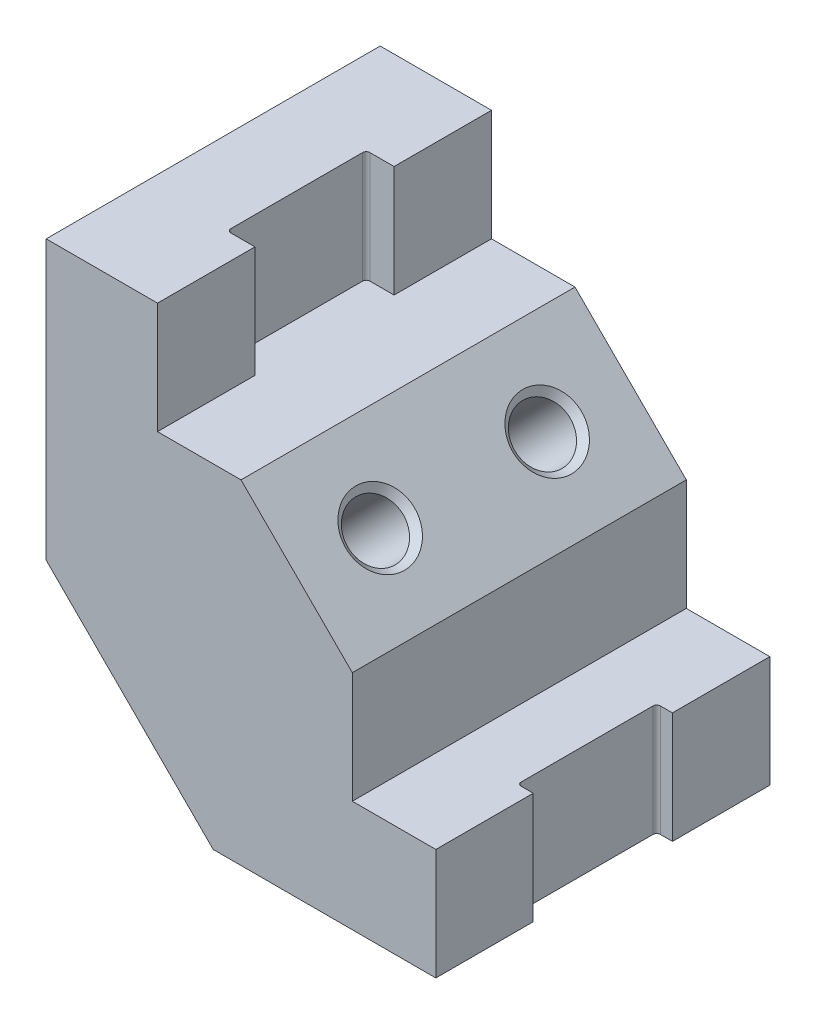
ISO-10303-21;
HEADER;
FILE_DESCRIPTION(('STEP AP214'),'2;1');
FILE_NAME('part.step','',(''),(''),'','','');
FILE_SCHEMA(('AUTOMOTIVE_DESIGN { 1 0 10303 214 1 1 1 1 }'));
ENDSEC;
DATA;
#1=APPLICATION_CONTEXT('core data for automotive mechanical design processes');
#2=APPLICATION_PROTOCOL_DEFINITION('international standard','automotive_design',2000,#1);
#3=PRODUCT_CONTEXT('',#1,'mechanical');
#4=PRODUCT('Part','Part','',(#3));
#5=PRODUCT_RELATED_PRODUCT_CATEGORY('part','',(#4));
#6=PRODUCT_DEFINITION_FORMATION('','',#4);
#7=PRODUCT_DEFINITION_CONTEXT('part definition',#1,'design');
#8=PRODUCT_DEFINITION('design','',#6,#7);
#9=PRODUCT_DEFINITION_SHAPE('','',#8);
#10=(LENGTH_UNIT() NAMED_UNIT(*) SI_UNIT(.MILLI.,.METRE.));
#11=(NAMED_UNIT(*) PLANE_ANGLE_UNIT() SI_UNIT($,.RADIAN.));
#12=(NAMED_UNIT(*) SI_UNIT($,.STERADIAN.) SOLID_ANGLE_UNIT());
#13=UNCERTAINTY_MEASURE_WITH_UNIT(LENGTH_MEASURE(1.E-05),#10,'distance_accuracy_value','');
#14=(GEOMETRIC_REPRESENTATION_CONTEXT(3) GLOBAL_UNCERTAINTY_ASSIGNED_CONTEXT((#13)) GLOBAL_UNIT_ASSIGNED_CONTEXT((#10,
#11,#12)) REPRESENTATION_CONTEXT('',''));
#15=CARTESIAN_POINT('',(0.,0.,0.));
#16=DIRECTION('',(0.,0.,1.));
#17=DIRECTION('',(1.,0.,0.));
#18=AXIS2_PLACEMENT_3D('',#15,#16,#17);
#19=CARTESIAN_POINT('',(88.9,-101.6,38.1));
#20=DIRECTION('',(-1.,0.,0.));
#21=DIRECTION('',(0.,0.,1.));
#22=AXIS2_PLACEMENT_3D('',#19,#20,#21);
#23=PLANE('',#22);
#24=DIRECTION('',(0.,0.,-1.));
#25=VECTOR('',#24,1.);
#26=CARTESIAN_POINT('',(88.9,-101.6,38.1));
#27=LINE('',#26,#25);
#28=CARTESIAN_POINT('',(88.9,-101.6,38.1));
#29=VERTEX_POINT('',#28);
#30=CARTESIAN_POINT('',(88.9,-101.6,15.875));
#31=VERTEX_POINT('',#30);
#32=EDGE_CURVE('E225',#29,#31,#27,.T.);
#33=ORIENTED_EDGE('',*,*,#32,.T.);
#34=DIRECTION('',(0.,1.,0.));
#35=VECTOR('',#34,1.);
#36=CARTESIAN_POINT('',(88.9,-101.6,15.875));
#37=LINE('',#36,#35);
#38=CARTESIAN_POINT('',(88.9,-76.2,15.875));
#39=VERTEX_POINT('',#38);
#40=EDGE_CURVE('E216',#31,#39,#37,.T.);
#41=ORIENTED_EDGE('',*,*,#40,.T.);
#42=DIRECTION('',(0.,0.,-1.));
#43=VECTOR('',#42,1.);
#44=CARTESIAN_POINT('',(88.9,-76.2,38.1));
#45=LINE('',#44,#43);
#46=CARTESIAN_POINT('',(88.9,-76.2,38.1));
#47=VERTEX_POINT('',#46);
#48=EDGE_CURVE('E226',#47,#39,#45,.T.);
#49=ORIENTED_EDGE('',*,*,#48,.F.);
#50=DIRECTION('',(0.,1.,0.));
#51=VECTOR('',#50,1.);
#52=CARTESIAN_POINT('',(88.9,-101.6,38.1));
#53=LINE('',#52,#51);
#54=EDGE_CURVE('E381',#29,#47,#53,.T.);
#55=ORIENTED_EDGE('',*,*,#54,.F.);
#56=EDGE_LOOP('',(#33,#41,#49,#55));
#57=FACE_BOUND('',#56,.T.);
#58=ADVANCED_FACE('F45',(#57),#23,.F.);
#59=CARTESIAN_POINT('',(25.4,-25.4,38.1));
#60=DIRECTION('',(-1.,0.,0.));
#61=DIRECTION('',(0.,0.,1.));
#62=AXIS2_PLACEMENT_3D('',#59,#60,#61);
#63=PLANE('',#62);
#64=DIRECTION('',(0.,0.,-1.));
#65=VECTOR('',#64,1.);
#66=CARTESIAN_POINT('',(25.4,0.,38.1));
#67=LINE('',#66,#65);
#68=CARTESIAN_POINT('',(25.4,0.,-15.875));
#69=VERTEX_POINT('',#68);
#70=CARTESIAN_POINT('',(25.4,0.,-38.1));
#71=VERTEX_POINT('',#70);
#72=EDGE_CURVE('E399',#69,#71,#67,.T.);
#73=ORIENTED_EDGE('',*,*,#72,.F.);
#74=DIRECTION('',(0.,1.,0.));
#75=VECTOR('',#74,1.);
#76=CARTESIAN_POINT('',(25.4,-57.7787739113142,-15.875));
#77=LINE('',#76,#75);
#78=CARTESIAN_POINT('',(25.4,-25.4,-15.875));
#79=VERTEX_POINT('',#78);
#80=EDGE_CURVE('E357',#79,#69,#77,.T.);
#81=ORIENTED_EDGE('',*,*,#80,.F.);
#82=DIRECTION('',(0.,0.,-1.));
#83=VECTOR('',#82,1.);
#84=CARTESIAN_POINT('',(25.4,-25.4,38.1));
#85=LINE('',#84,#83);
#86=CARTESIAN_POINT('',(25.4,-25.4,-38.1));
#87=VERTEX_POINT('',#86);
#88=EDGE_CURVE('E433',#79,#87,#85,.T.);
#89=ORIENTED_EDGE('',*,*,#88,.T.);
#90=DIRECTION('',(0.,1.,0.));
#91=VECTOR('',#90,1.);
#92=CARTESIAN_POINT('',(25.4,-25.4,-38.1));
#93=LINE('',#92,#91);
#94=EDGE_CURVE('E372',#87,#71,#93,.T.);
#95=ORIENTED_EDGE('',*,*,#94,.T.);
#96=EDGE_LOOP('',(#73,#81,#89,#95));
#97=FACE_BOUND('',#96,.T.);
#98=ADVANCED_FACE('F498',(#97),#63,.F.);
#99=CARTESIAN_POINT('',(25.4,0.,38.1));
#100=DIRECTION('',(0.,-1.,0.));
#101=DIRECTION('',(1.,0.,0.));
#102=AXIS2_PLACEMENT_3D('',#99,#100,#101);
#103=PLANE('',#102);
#104=DIRECTION('',(0.,0.,1.));
#105=VECTOR('',#104,1.);
#106=CARTESIAN_POINT('',(19.05,0.,-15.875));
#107=LINE('',#106,#105);
#108=CARTESIAN_POINT('',(19.05,0.,-15.0368));
#109=VERTEX_POINT('',#108);
#110=CARTESIAN_POINT('',(19.05,0.,15.0368));
#111=VERTEX_POINT('',#110);
#112=EDGE_CURVE('E325',#109,#111,#107,.T.);
#113=ORIENTED_EDGE('',*,*,#112,.F.);
#114=CARTESIAN_POINT('',(19.8882,0.,-15.0368));
#115=DIRECTION('',(0.,-1.,0.));
#116=DIRECTION('',(1.,0.,0.));
#117=AXIS2_PLACEMENT_3D('',#114,#115,#116);
#118=CIRCLE('',#117,0.8382);
#119=CARTESIAN_POINT('',(19.8882,0.,-15.875));
#120=VERTEX_POINT('',#119);
#121=EDGE_CURVE('E11',#109,#120,#118,.T.);
#122=ORIENTED_EDGE('',*,*,#121,.T.);
#123=DIRECTION('',(-1.,0.,0.));
#124=VECTOR('',#123,1.);
#125=CARTESIAN_POINT('',(25.4,0.,-15.875));
#126=LINE('',#125,#124);
#127=EDGE_CURVE('E337',#69,#120,#126,.T.);
#128=ORIENTED_EDGE('',*,*,#127,.F.);
#129=ORIENTED_EDGE('',*,*,#72,.T.);
#130=DIRECTION('',(-1.,0.,0.));
#131=VECTOR('',#130,1.);
#132=CARTESIAN_POINT('',(25.4,0.,-38.1));
#133=LINE('',#132,#131);
#134=CARTESIAN_POINT('',(0.,0.,-38.1));
#135=VERTEX_POINT('',#134);
#136=EDGE_CURVE('E366',#71,#135,#133,.T.);
#137=ORIENTED_EDGE('',*,*,#136,.T.);
#138=DIRECTION('',(0.,0.,-1.));
#139=VECTOR('',#138,1.);
#140=CARTESIAN_POINT('',(0.,0.,38.1));
#141=LINE('',#140,#139);
#142=CARTESIAN_POINT('',(0.,0.,38.1));
#143=VERTEX_POINT('',#142);
#144=EDGE_CURVE('E242',#143,#135,#141,.T.);
#145=ORIENTED_EDGE('',*,*,#144,.F.);
#146=DIRECTION('',(-1.,0.,0.));
#147=VECTOR('',#146,1.);
#148=CARTESIAN_POINT('',(25.4,0.,38.1));
#149=LINE('',#148,#147);
#150=CARTESIAN_POINT('',(25.4,0.,38.1));
#151=VERTEX_POINT('',#150);
#152=EDGE_CURVE('E367',#151,#143,#149,.T.);
#153=ORIENTED_EDGE('',*,*,#152,.F.);
#154=CARTESIAN_POINT('',(25.4,0.,15.875));
#155=VERTEX_POINT('',#154);
#156=EDGE_CURVE('E430',#151,#155,#67,.T.);
#157=ORIENTED_EDGE('',*,*,#156,.T.);
#158=DIRECTION('',(1.,0.,0.));
#159=VECTOR('',#158,1.);
#160=CARTESIAN_POINT('',(25.4,0.,15.875));
#161=LINE('',#160,#159);
#162=CARTESIAN_POINT('',(19.8882,0.,15.875));
#163=VERTEX_POINT('',#162);
#164=EDGE_CURVE('E327',#163,#155,#161,.T.);
#165=ORIENTED_EDGE('',*,*,#164,.F.);
#166=CARTESIAN_POINT('',(19.8882,0.,15.0368));
#167=DIRECTION('',(0.,-1.,0.));
#168=DIRECTION('',(1.,0.,0.));
#169=AXIS2_PLACEMENT_3D('',#166,#167,#168);
#170=CIRCLE('',#169,0.8382);
#171=EDGE_CURVE('E54',#163,#111,#170,.T.);
#172=ORIENTED_EDGE('',*,*,#171,.T.);
#173=EDGE_LOOP('',(#113,#122,#128,#129,#137,#145,#153,#157,#165,#172));
#174=FACE_BOUND('',#173,.T.);
#175=ADVANCED_FACE('F324',(#174),#103,.F.);
#176=CARTESIAN_POINT('',(0.,0.,38.1));
#177=DIRECTION('',(1.,0.,0.));
#178=DIRECTION('',(0.,1.,0.));
#179=AXIS2_PLACEMENT_3D('',#176,#177,#178);
#180=PLANE('',#179);
#181=DIRECTION('',(0.,-1.,0.));
#182=VECTOR('',#181,1.);
#183=CARTESIAN_POINT('',(0.,0.,-38.1));
#184=LINE('',#183,#182);
#185=CARTESIAN_POINT('',(0.,-63.4999999999999,-38.1));
#186=VERTEX_POINT('',#185);
#187=EDGE_CURVE('E403',#135,#186,#184,.T.);
#188=ORIENTED_EDGE('',*,*,#187,.T.);
#189=DIRECTION('',(0.,0.,-1.));
#190=VECTOR('',#189,1.);
#191=CARTESIAN_POINT('',(0.,-63.4999999999999,38.1));
#192=LINE('',#191,#190);
#193=CARTESIAN_POINT('',(0.,-63.4999999999999,38.1));
#194=VERTEX_POINT('',#193);
#195=EDGE_CURVE('E238',#194,#186,#192,.T.);
#196=ORIENTED_EDGE('',*,*,#195,.F.);
#197=DIRECTION('',(0.,-1.,0.));
#198=VECTOR('',#197,1.);
#199=CARTESIAN_POINT('',(0.,0.,38.1));
#200=LINE('',#199,#198);
#201=EDGE_CURVE('E371',#143,#194,#200,.T.);
#202=ORIENTED_EDGE('',*,*,#201,.F.);
#203=ORIENTED_EDGE('',*,*,#144,.T.);
#204=EDGE_LOOP('',(#188,#196,#202,#203));
#205=FACE_BOUND('',#204,.T.);
#206=ADVANCED_FACE('F517',(#205),#180,.F.);
#207=CARTESIAN_POINT('',(0.,-63.4999999999999,38.1));
#208=DIRECTION('',(0.707106781186548,0.707106781186546,0.));
#209=DIRECTION('',(-0.707106781186547,0.707106781186549,0.));
#210=AXIS2_PLACEMENT_3D('',#207,#208,#209);
#211=PLANE('',#210);
#212=CARTESIAN_POINT('',(15.8769178448081,-79.3769178448081,-19.05));
#213=DIRECTION('',(0.707106781186548,0.707106781186546,0.));
#214=DIRECTION('',(-0.707106781186547,0.707106781186549,0.));
#215=AXIS2_PLACEMENT_3D('',#212,#213,#214);
#216=CIRCLE('',#215,7.87399999999996);
#217=CARTESIAN_POINT('',(21.444676639871,-84.9446766398709,-19.05));
#218=VERTEX_POINT('',#217);
#219=EDGE_CURVE('E250',#218,#218,#216,.T.);
#220=ORIENTED_EDGE('',*,*,#219,.T.);
#221=EDGE_LOOP('',(#220));
#222=FACE_BOUND('',#221,.T.);
#223=CARTESIAN_POINT('',(15.8769178448081,-79.3769178448081,19.05));
#224=DIRECTION('',(0.707106781186548,0.707106781186546,0.));
#225=DIRECTION('',(-0.707106781186547,0.707106781186549,0.));
#226=AXIS2_PLACEMENT_3D('',#223,#224,#225);
#227=CIRCLE('',#226,7.87399999999999);
#228=CARTESIAN_POINT('',(10.3091590497453,-73.8091590497452,19.05));
#229=VERTEX_POINT('',#228);
#230=EDGE_CURVE('E246',#229,#229,#227,.T.);
#231=ORIENTED_EDGE('',*,*,#230,.T.);
#232=EDGE_LOOP('',(#231));
#233=FACE_BOUND('',#232,.T.);
#234=DIRECTION('',(0.707106781186546,-0.707106781186548,0.));
#235=VECTOR('',#234,1.);
#236=CARTESIAN_POINT('',(0.,-63.4999999999999,-38.1));
#237=LINE('',#236,#235);
#238=CARTESIAN_POINT('',(38.1,-101.6,-38.1));
#239=VERTEX_POINT('',#238);
#240=EDGE_CURVE('E406',#186,#239,#237,.T.);
#241=ORIENTED_EDGE('',*,*,#240,.T.);
#242=DIRECTION('',(0.,0.,-1.));
#243=VECTOR('',#242,1.);
#244=CARTESIAN_POINT('',(38.1,-101.6,38.1));
#245=LINE('',#244,#243);
#246=CARTESIAN_POINT('',(38.1,-101.6,38.1));
#247=VERTEX_POINT('',#246);
#248=EDGE_CURVE('E231',#247,#239,#245,.T.);
#249=ORIENTED_EDGE('',*,*,#248,.F.);
#250=DIRECTION('',(0.707106781186546,-0.707106781186548,0.));
#251=VECTOR('',#250,1.);
#252=CARTESIAN_POINT('',(0.,-63.4999999999999,38.1));
#253=LINE('',#252,#251);
#254=EDGE_CURVE('E375',#194,#247,#253,.T.);
#255=ORIENTED_EDGE('',*,*,#254,.F.);
#256=ORIENTED_EDGE('',*,*,#195,.T.);
#257=EDGE_LOOP('',(#241,#249,#255,#256));
#258=FACE_BOUND('',#257,.T.);
#259=ADVANCED_FACE('F513',(#222,#233,#258),#211,.F.);
#260=CARTESIAN_POINT('',(38.1,-101.6,38.1));
#261=DIRECTION('',(0.,1.,0.));
#262=DIRECTION('',(0.,0.,1.));
#263=AXIS2_PLACEMENT_3D('',#260,#261,#262);
#264=PLANE('',#263);
#265=DIRECTION('',(-1.,0.,0.));
#266=VECTOR('',#265,1.);
#267=CARTESIAN_POINT('',(88.9,-101.6,-15.875));
#268=LINE('',#267,#266);
#269=CARTESIAN_POINT('',(88.9,-101.6,-15.875));
#270=VERTEX_POINT('',#269);
#271=CARTESIAN_POINT('',(86.1478547786392,-101.6,-15.875));
#272=VERTEX_POINT('',#271);
#273=EDGE_CURVE('E193',#270,#272,#268,.T.);
#274=ORIENTED_EDGE('',*,*,#273,.T.);
#275=CARTESIAN_POINT('',(86.1478547786392,-101.6,-15.0368));
#276=DIRECTION('',(0.,1.,0.));
#277=DIRECTION('',(0.,0.,1.));
#278=AXIS2_PLACEMENT_3D('',#275,#276,#277);
#279=CIRCLE('',#278,0.8382);
#280=CARTESIAN_POINT('',(85.3096547786392,-101.6,-15.0368));
#281=VERTEX_POINT('',#280);
#282=EDGE_CURVE('E319',#272,#281,#279,.T.);
#283=ORIENTED_EDGE('',*,*,#282,.T.);
#284=DIRECTION('',(0.,0.,1.));
#285=VECTOR('',#284,1.);
#286=CARTESIAN_POINT('',(85.3096547786392,-101.6,-15.875));
#287=LINE('',#286,#285);
#288=CARTESIAN_POINT('',(85.3096547786392,-101.6,15.0368));
#289=VERTEX_POINT('',#288);
#290=EDGE_CURVE('E205',#281,#289,#287,.T.);
#291=ORIENTED_EDGE('',*,*,#290,.T.);
#292=CARTESIAN_POINT('',(86.1478547786392,-101.6,15.0368));
#293=DIRECTION('',(0.,1.,0.));
#294=DIRECTION('',(0.,0.,1.));
#295=AXIS2_PLACEMENT_3D('',#292,#293,#294);
#296=CIRCLE('',#295,0.8382);
#297=CARTESIAN_POINT('',(86.1478547786392,-101.6,15.875));
#298=VERTEX_POINT('',#297);
#299=EDGE_CURVE('E313',#289,#298,#296,.T.);
#300=ORIENTED_EDGE('',*,*,#299,.T.);
#301=DIRECTION('',(1.,0.,0.));
#302=VECTOR('',#301,1.);
#303=CARTESIAN_POINT('',(88.9,-101.6,15.875));
#304=LINE('',#303,#302);
#305=EDGE_CURVE('E217',#298,#31,#304,.T.);
#306=ORIENTED_EDGE('',*,*,#305,.T.);
#307=ORIENTED_EDGE('',*,*,#32,.F.);
#308=DIRECTION('',(1.,0.,0.));
#309=VECTOR('',#308,1.);
#310=CARTESIAN_POINT('',(38.1,-101.6,38.1));
#311=LINE('',#310,#309);
#312=EDGE_CURVE('E378',#247,#29,#311,.T.);
#313=ORIENTED_EDGE('',*,*,#312,.F.);
#314=ORIENTED_EDGE('',*,*,#248,.T.);
#315=DIRECTION('',(1.,0.,0.));
#316=VECTOR('',#315,1.);
#317=CARTESIAN_POINT('',(38.1,-101.6,-38.1));
#318=LINE('',#317,#316);
#319=CARTESIAN_POINT('',(88.9,-101.6,-38.1));
#320=VERTEX_POINT('',#319);
#321=EDGE_CURVE('E222',#239,#320,#318,.T.);
#322=ORIENTED_EDGE('',*,*,#321,.T.);
#323=EDGE_CURVE('E212',#270,#320,#27,.T.);
#324=ORIENTED_EDGE('',*,*,#323,.F.);
#325=EDGE_LOOP('',(#274,#283,#291,#300,#306,#307,#313,#314,#322,#324));
#326=FACE_BOUND('',#325,.T.);
#327=ADVANCED_FACE('F219',(#326),#264,.F.);
#328=CARTESIAN_POINT('',(88.9,-76.2,-15.875));
#329=VERTEX_POINT('',#328);
#330=CARTESIAN_POINT('',(88.9,-76.2,-38.1));
#331=VERTEX_POINT('',#330);
#332=EDGE_CURVE('E214',#329,#331,#45,.T.);
#333=ORIENTED_EDGE('',*,*,#332,.F.);
#334=DIRECTION('',(0.,1.,0.));
#335=VECTOR('',#334,1.);
#336=CARTESIAN_POINT('',(88.9,-101.6,-15.875));
#337=LINE('',#336,#335);
#338=EDGE_CURVE('E197',#270,#329,#337,.T.);
#339=ORIENTED_EDGE('',*,*,#338,.F.);
#340=ORIENTED_EDGE('',*,*,#323,.T.);
#341=DIRECTION('',(0.,1.,0.));
#342=VECTOR('',#341,1.);
#343=CARTESIAN_POINT('',(88.9,-101.6,-38.1));
#344=LINE('',#343,#342);
#345=EDGE_CURVE('E411',#320,#331,#344,.T.);
#346=ORIENTED_EDGE('',*,*,#345,.T.);
#347=EDGE_LOOP('',(#333,#339,#340,#346));
#348=FACE_BOUND('',#347,.T.);
#349=ADVANCED_FACE('F210',(#348),#23,.F.);
#350=CARTESIAN_POINT('',(88.9,-76.2,38.1));
#351=DIRECTION('',(0.,-1.,0.));
#352=DIRECTION('',(1.,0.,0.));
#353=AXIS2_PLACEMENT_3D('',#350,#351,#352);
#354=PLANE('',#353);
#355=ORIENTED_EDGE('',*,*,#48,.T.);
#356=DIRECTION('',(1.,0.,0.));
#357=VECTOR('',#356,1.);
#358=CARTESIAN_POINT('',(88.9,-76.2,15.875));
#359=LINE('',#358,#357);
#360=CARTESIAN_POINT('',(86.1478547786392,-76.2,15.875));
#361=VERTEX_POINT('',#360);
#362=EDGE_CURVE('E206',#361,#39,#359,.T.);
#363=ORIENTED_EDGE('',*,*,#362,.F.);
#364=CARTESIAN_POINT('',(86.1478547786392,-76.2,15.0368));
#365=DIRECTION('',(0.,-1.,0.));
#366=DIRECTION('',(1.,0.,0.));
#367=AXIS2_PLACEMENT_3D('',#364,#365,#366);
#368=CIRCLE('',#367,0.8382);
#369=CARTESIAN_POINT('',(85.3096547786392,-76.2,15.0368));
#370=VERTEX_POINT('',#369);
#371=EDGE_CURVE('E310',#361,#370,#368,.T.);
#372=ORIENTED_EDGE('',*,*,#371,.T.);
#373=DIRECTION('',(0.,0.,1.));
#374=VECTOR('',#373,1.);
#375=CARTESIAN_POINT('',(85.3096547786392,-76.2,-15.875));
#376=LINE('',#375,#374);
#377=CARTESIAN_POINT('',(85.3096547786392,-76.2,-15.0368));
#378=VERTEX_POINT('',#377);
#379=EDGE_CURVE('E579',#378,#370,#376,.T.);
#380=ORIENTED_EDGE('',*,*,#379,.F.);
#381=CARTESIAN_POINT('',(86.1478547786392,-76.2,-15.0368));
#382=DIRECTION('',(0.,-1.,0.));
#383=DIRECTION('',(1.,0.,0.));
#384=AXIS2_PLACEMENT_3D('',#381,#382,#383);
#385=CIRCLE('',#384,0.8382);
#386=CARTESIAN_POINT('',(86.1478547786392,-76.2,-15.875));
#387=VERTEX_POINT('',#386);
#388=EDGE_CURVE('E316',#378,#387,#385,.T.);
#389=ORIENTED_EDGE('',*,*,#388,.T.);
#390=DIRECTION('',(-1.,0.,0.));
#391=VECTOR('',#390,1.);
#392=CARTESIAN_POINT('',(88.9,-76.2,-15.875));
#393=LINE('',#392,#391);
#394=EDGE_CURVE('E455',#329,#387,#393,.T.);
#395=ORIENTED_EDGE('',*,*,#394,.F.);
#396=ORIENTED_EDGE('',*,*,#332,.T.);
#397=DIRECTION('',(-1.,0.,0.));
#398=VECTOR('',#397,1.);
#399=CARTESIAN_POINT('',(88.9,-76.2,-38.1));
#400=LINE('',#399,#398);
#401=CARTESIAN_POINT('',(69.8499999999999,-76.2,-38.1));
#402=VERTEX_POINT('',#401);
#403=EDGE_CURVE('E414',#331,#402,#400,.T.);
#404=ORIENTED_EDGE('',*,*,#403,.T.);
#405=DIRECTION('',(0.,0.,-1.));
#406=VECTOR('',#405,1.);
#407=CARTESIAN_POINT('',(69.8499999999999,-76.2,38.1));
#408=LINE('',#407,#406);
#409=CARTESIAN_POINT('',(69.8499999999999,-76.2,38.1));
#410=VERTEX_POINT('',#409);
#411=EDGE_CURVE('E444',#410,#402,#408,.T.);
#412=ORIENTED_EDGE('',*,*,#411,.F.);
#413=DIRECTION('',(-1.,0.,0.));
#414=VECTOR('',#413,1.);
#415=CARTESIAN_POINT('',(88.9,-76.2,38.1));
#416=LINE('',#415,#414);
#417=EDGE_CURVE('E384',#47,#410,#416,.T.);
#418=ORIENTED_EDGE('',*,*,#417,.F.);
#419=EDGE_LOOP('',(#355,#363,#372,#380,#389,#395,#396,#404,#412,#418));
#420=FACE_BOUND('',#419,.T.);
#421=ADVANCED_FACE('F453',(#420),#354,.F.);
#422=CARTESIAN_POINT('',(69.8499999999999,-76.2,38.1));
#423=DIRECTION('',(-1.,0.,0.));
#424=DIRECTION('',(0.,0.,1.));
#425=AXIS2_PLACEMENT_3D('',#422,#423,#424);
#426=PLANE('',#425);
#427=DIRECTION('',(0.,1.,0.));
#428=VECTOR('',#427,1.);
#429=CARTESIAN_POINT('',(69.8499999999999,-76.2,-38.1));
#430=LINE('',#429,#428);
#431=CARTESIAN_POINT('',(69.8499999999999,-50.8,-38.1));
#432=VERTEX_POINT('',#431);
#433=EDGE_CURVE('E417',#402,#432,#430,.T.);
#434=ORIENTED_EDGE('',*,*,#433,.T.);
#435=DIRECTION('',(0.,0.,-1.));
#436=VECTOR('',#435,1.);
#437=CARTESIAN_POINT('',(69.8499999999999,-50.8,38.1));
#438=LINE('',#437,#436);
#439=CARTESIAN_POINT('',(69.8499999999999,-50.8,38.1));
#440=VERTEX_POINT('',#439);
#441=EDGE_CURVE('E441',#440,#432,#438,.T.);
#442=ORIENTED_EDGE('',*,*,#441,.F.);
#443=DIRECTION('',(0.,1.,0.));
#444=VECTOR('',#443,1.);
#445=CARTESIAN_POINT('',(69.8499999999999,-76.2,38.1));
#446=LINE('',#445,#444);
#447=EDGE_CURVE('E387',#410,#440,#446,.T.);
#448=ORIENTED_EDGE('',*,*,#447,.F.);
#449=ORIENTED_EDGE('',*,*,#411,.T.);
#450=EDGE_LOOP('',(#434,#442,#448,#449));
#451=FACE_BOUND('',#450,.T.);
#452=ADVANCED_FACE('F462',(#451),#426,.F.);
#453=CARTESIAN_POINT('',(69.8499999999999,-50.8,38.1));
#454=DIRECTION('',(-0.707106781186549,-0.707106781186546,0.));
#455=DIRECTION('',(0.707106781186546,-0.707106781186549,0.));
#456=AXIS2_PLACEMENT_3D('',#453,#454,#455);
#457=PLANE('',#456);
#458=CARTESIAN_POINT('',(57.1519178448082,-38.1019178448082,-19.05));
#459=DIRECTION('',(-0.707106781186549,-0.707106781186546,0.));
#460=DIRECTION('',(0.707106781186546,-0.707106781186549,0.));
#461=AXIS2_PLACEMENT_3D('',#458,#459,#460);
#462=CIRCLE('',#461,7.87400000000007);
#463=CARTESIAN_POINT('',(62.7196766398711,-43.6696766398711,-19.05));
#464=VERTEX_POINT('',#463);
#465=EDGE_CURVE('E274',#464,#464,#462,.T.);
#466=ORIENTED_EDGE('',*,*,#465,.T.);
#467=EDGE_LOOP('',(#466));
#468=FACE_BOUND('',#467,.T.);
#469=CARTESIAN_POINT('',(57.1519178448082,-38.1019178448082,19.05));
#470=DIRECTION('',(-0.707106781186549,-0.707106781186546,0.));
#471=DIRECTION('',(0.707106781186546,-0.707106781186549,0.));
#472=AXIS2_PLACEMENT_3D('',#469,#470,#471);
#473=CIRCLE('',#472,7.87400000000003);
#474=CARTESIAN_POINT('',(62.719676639871,-43.6696766398711,19.05));
#475=VERTEX_POINT('',#474);
#476=EDGE_CURVE('E270',#475,#475,#473,.T.);
#477=ORIENTED_EDGE('',*,*,#476,.T.);
#478=EDGE_LOOP('',(#477));
#479=FACE_BOUND('',#478,.T.);
#480=DIRECTION('',(-0.707106781186546,0.707106781186549,0.));
#481=VECTOR('',#480,1.);
#482=CARTESIAN_POINT('',(69.8499999999999,-50.8,-38.1));
#483=LINE('',#482,#481);
#484=CARTESIAN_POINT('',(44.45,-25.4,-38.1));
#485=VERTEX_POINT('',#484);
#486=EDGE_CURVE('E420',#432,#485,#483,.T.);
#487=ORIENTED_EDGE('',*,*,#486,.T.);
#488=DIRECTION('',(0.,0.,-1.));
#489=VECTOR('',#488,1.);
#490=CARTESIAN_POINT('',(44.45,-25.4,38.1));
#491=LINE('',#490,#489);
#492=CARTESIAN_POINT('',(44.45,-25.4,38.1));
#493=VERTEX_POINT('',#492);
#494=EDGE_CURVE('E437',#493,#485,#491,.T.);
#495=ORIENTED_EDGE('',*,*,#494,.F.);
#496=DIRECTION('',(-0.707106781186546,0.707106781186549,0.));
#497=VECTOR('',#496,1.);
#498=CARTESIAN_POINT('',(69.8499999999999,-50.8,38.1));
#499=LINE('',#498,#497);
#500=EDGE_CURVE('E390',#440,#493,#499,.T.);
#501=ORIENTED_EDGE('',*,*,#500,.F.);
#502=ORIENTED_EDGE('',*,*,#441,.T.);
#503=EDGE_LOOP('',(#487,#495,#501,#502));
#504=FACE_BOUND('',#503,.T.);
#505=ADVANCED_FACE('F465',(#468,#479,#504),#457,.F.);
#506=CARTESIAN_POINT('',(44.45,-25.4,38.1));
#507=DIRECTION('',(0.,-1.,0.));
#508=DIRECTION('',(1.,0.,0.));
#509=AXIS2_PLACEMENT_3D('',#506,#507,#508);
#510=PLANE('',#509);
#511=DIRECTION('',(0.,0.,1.));
#512=VECTOR('',#511,1.);
#513=CARTESIAN_POINT('',(19.05,-25.4,-15.875));
#514=LINE('',#513,#512);
#515=CARTESIAN_POINT('',(19.05,-25.4,-15.0368));
#516=VERTEX_POINT('',#515);
#517=CARTESIAN_POINT('',(19.05,-25.4,15.0368));
#518=VERTEX_POINT('',#517);
#519=EDGE_CURVE('E347',#516,#518,#514,.T.);
#520=ORIENTED_EDGE('',*,*,#519,.T.);
#521=CARTESIAN_POINT('',(19.8882,-25.4,15.0368));
#522=DIRECTION('',(0.,-1.,0.));
#523=DIRECTION('',(1.,0.,0.));
#524=AXIS2_PLACEMENT_3D('',#521,#522,#523);
#525=CIRCLE('',#524,0.8382);
#526=CARTESIAN_POINT('',(19.8882,-25.4,15.875));
#527=VERTEX_POINT('',#526);
#528=EDGE_CURVE('E305',#518,#527,#525,.F.);
#529=ORIENTED_EDGE('',*,*,#528,.T.);
#530=DIRECTION('',(1.,0.,0.));
#531=VECTOR('',#530,1.);
#532=CARTESIAN_POINT('',(25.4,-25.4,15.875));
#533=LINE('',#532,#531);
#534=CARTESIAN_POINT('',(25.4,-25.4,15.875));
#535=VERTEX_POINT('',#534);
#536=EDGE_CURVE('E345',#527,#535,#533,.T.);
#537=ORIENTED_EDGE('',*,*,#536,.T.);
#538=CARTESIAN_POINT('',(25.4,-25.4,38.1));
#539=VERTEX_POINT('',#538);
#540=EDGE_CURVE('E434',#539,#535,#85,.T.);
#541=ORIENTED_EDGE('',*,*,#540,.F.);
#542=DIRECTION('',(-1.,0.,0.));
#543=VECTOR('',#542,1.);
#544=CARTESIAN_POINT('',(44.45,-25.4,38.1));
#545=LINE('',#544,#543);
#546=EDGE_CURVE('E393',#493,#539,#545,.T.);
#547=ORIENTED_EDGE('',*,*,#546,.F.);
#548=ORIENTED_EDGE('',*,*,#494,.T.);
#549=DIRECTION('',(-1.,0.,0.));
#550=VECTOR('',#549,1.);
#551=CARTESIAN_POINT('',(44.45,-25.4,-38.1));
#552=LINE('',#551,#550);
#553=EDGE_CURVE('E423',#485,#87,#552,.T.);
#554=ORIENTED_EDGE('',*,*,#553,.T.);
#555=ORIENTED_EDGE('',*,*,#88,.F.);
#556=DIRECTION('',(-1.,0.,0.));
#557=VECTOR('',#556,1.);
#558=CARTESIAN_POINT('',(25.4,-25.4,-15.875));
#559=LINE('',#558,#557);
#560=CARTESIAN_POINT('',(19.8882,-25.4,-15.875));
#561=VERTEX_POINT('',#560);
#562=EDGE_CURVE('E359',#79,#561,#559,.T.);
#563=ORIENTED_EDGE('',*,*,#562,.T.);
#564=CARTESIAN_POINT('',(19.8882,-25.4,-15.0368));
#565=DIRECTION('',(0.,-1.,0.));
#566=DIRECTION('',(1.,0.,0.));
#567=AXIS2_PLACEMENT_3D('',#564,#565,#566);
#568=CIRCLE('',#567,0.8382);
#569=EDGE_CURVE('E302',#561,#516,#568,.F.);
#570=ORIENTED_EDGE('',*,*,#569,.T.);
#571=EDGE_LOOP('',(#520,#529,#537,#541,#547,#548,#554,#555,#563,#570));
#572=FACE_BOUND('',#571,.T.);
#573=ADVANCED_FACE('F343',(#572),#510,.F.);
#574=ORIENTED_EDGE('',*,*,#540,.T.);
#575=DIRECTION('',(0.,1.,0.));
#576=VECTOR('',#575,1.);
#577=CARTESIAN_POINT('',(25.4,-57.7787739113142,15.875));
#578=LINE('',#577,#576);
#579=EDGE_CURVE('E351',#535,#155,#578,.T.);
#580=ORIENTED_EDGE('',*,*,#579,.T.);
#581=ORIENTED_EDGE('',*,*,#156,.F.);
#582=DIRECTION('',(0.,1.,0.));
#583=VECTOR('',#582,1.);
#584=CARTESIAN_POINT('',(25.4,-25.4,38.1));
#585=LINE('',#584,#583);
#586=EDGE_CURVE('E396',#539,#151,#585,.T.);
#587=ORIENTED_EDGE('',*,*,#586,.F.);
#588=EDGE_LOOP('',(#574,#580,#581,#587));
#589=FACE_BOUND('',#588,.T.);
#590=ADVANCED_FACE('F505',(#589),#63,.F.);
#591=CARTESIAN_POINT('',(0.,0.,38.1));
#592=DIRECTION('',(0.,0.,1.));
#593=DIRECTION('',(1.,0.,0.));
#594=AXIS2_PLACEMENT_3D('',#591,#592,#593);
#595=PLANE('',#594);
#596=ORIENTED_EDGE('',*,*,#152,.T.);
#597=ORIENTED_EDGE('',*,*,#201,.T.);
#598=ORIENTED_EDGE('',*,*,#254,.T.);
#599=ORIENTED_EDGE('',*,*,#312,.T.);
#600=ORIENTED_EDGE('',*,*,#54,.T.);
#601=ORIENTED_EDGE('',*,*,#417,.T.);
#602=ORIENTED_EDGE('',*,*,#447,.T.);
#603=ORIENTED_EDGE('',*,*,#500,.T.);
#604=ORIENTED_EDGE('',*,*,#546,.T.);
#605=ORIENTED_EDGE('',*,*,#586,.T.);
#606=EDGE_LOOP('',(#596,#597,#598,#599,#600,#601,#602,#603,#604,#605));
#607=FACE_BOUND('',#606,.T.);
#608=ADVANCED_FACE('F469',(#607),#595,.T.);
#609=CARTESIAN_POINT('',(0.,0.,-38.1));
#610=DIRECTION('',(0.,0.,1.));
#611=DIRECTION('',(1.,0.,0.));
#612=AXIS2_PLACEMENT_3D('',#609,#610,#611);
#613=PLANE('',#612);
#614=ORIENTED_EDGE('',*,*,#136,.F.);
#615=ORIENTED_EDGE('',*,*,#94,.F.);
#616=ORIENTED_EDGE('',*,*,#553,.F.);
#617=ORIENTED_EDGE('',*,*,#486,.F.);
#618=ORIENTED_EDGE('',*,*,#433,.F.);
#619=ORIENTED_EDGE('',*,*,#403,.F.);
#620=ORIENTED_EDGE('',*,*,#345,.F.);
#621=ORIENTED_EDGE('',*,*,#321,.F.);
#622=ORIENTED_EDGE('',*,*,#240,.F.);
#623=ORIENTED_EDGE('',*,*,#187,.F.);
#624=EDGE_LOOP('',(#614,#615,#616,#617,#618,#619,#620,#621,#622,#623));
#625=FACE_BOUND('',#624,.T.);
#626=ADVANCED_FACE('F458',(#625),#613,.F.);
#627=CARTESIAN_POINT('',(-3.17308215519193,-98.4269178448081,-19.05));
#628=DIRECTION('',(0.707106781186549,0.707106781186546,0.));
#629=DIRECTION('',(-0.707106781186546,0.707106781186549,0.));
#630=AXIS2_PLACEMENT_3D('',#627,#628,#629);
#631=CYLINDRICAL_SURFACE('',#630,6.35);
#632=CARTESIAN_POINT('',(16.9545485793364,-78.2992871102798,-19.05));
#633=DIRECTION('',(0.707106781186547,0.707106781186547,0.));
#634=DIRECTION('',(-0.707106781186548,0.707106781186548,0.));
#635=AXIS2_PLACEMENT_3D('',#632,#633,#634);
#636=CIRCLE('',#635,6.35);
#637=CARTESIAN_POINT('',(21.444676639871,-82.7894151708144,-19.05));
#638=VERTEX_POINT('',#637);
#639=EDGE_CURVE('E258',#638,#638,#636,.F.);
#640=ORIENTED_EDGE('',*,*,#639,.T.);
#641=EDGE_LOOP('',(#640));
#642=FACE_BOUND('',#641,.T.);
#643=CARTESIAN_POINT('',(56.0742871102798,-39.1795485793365,-19.05));
#644=DIRECTION('',(-0.70710678118655,-0.707106781186545,0.));
#645=DIRECTION('',(0.707106781186545,-0.70710678118655,0.));
#646=AXIS2_PLACEMENT_3D('',#643,#644,#645);
#647=CIRCLE('',#646,6.35);
#648=CARTESIAN_POINT('',(60.5644151708144,-43.6696766398711,-19.05));
#649=VERTEX_POINT('',#648);
#650=EDGE_CURVE('E254',#649,#649,#647,.F.);
#651=ORIENTED_EDGE('',*,*,#650,.T.);
#652=EDGE_LOOP('',(#651));
#653=FACE_BOUND('',#652,.T.);
#654=ADVANCED_FACE('F764',(#642,#653),#631,.F.);
#655=CARTESIAN_POINT('',(-3.17308215519193,-98.4269178448081,19.05));
#656=DIRECTION('',(0.707106781186549,0.707106781186546,0.));
#657=DIRECTION('',(-0.707106781186546,0.707106781186549,0.));
#658=AXIS2_PLACEMENT_3D('',#655,#656,#657);
#659=CYLINDRICAL_SURFACE('',#658,6.35);
#660=CARTESIAN_POINT('',(16.9545485793364,-78.2992871102798,19.05));
#661=DIRECTION('',(0.70710678118655,0.707106781186545,0.));
#662=DIRECTION('',(-0.707106781186545,0.70710678118655,0.));
#663=AXIS2_PLACEMENT_3D('',#660,#661,#662);
#664=CIRCLE('',#663,6.35);
#665=CARTESIAN_POINT('',(12.4644205188019,-73.8091590497452,19.05));
#666=VERTEX_POINT('',#665);
#667=EDGE_CURVE('E266',#666,#666,#664,.F.);
#668=ORIENTED_EDGE('',*,*,#667,.T.);
#669=EDGE_LOOP('',(#668));
#670=FACE_BOUND('',#669,.T.);
#671=CARTESIAN_POINT('',(56.0742871102798,-39.1795485793365,19.05));
#672=DIRECTION('',(-0.70710678118655,-0.707106781186545,0.));
#673=DIRECTION('',(0.707106781186545,-0.70710678118655,0.));
#674=AXIS2_PLACEMENT_3D('',#671,#672,#673);
#675=CIRCLE('',#674,6.35);
#676=CARTESIAN_POINT('',(60.5644151708144,-43.6696766398711,19.05));
#677=VERTEX_POINT('',#676);
#678=EDGE_CURVE('E262',#677,#677,#675,.F.);
#679=ORIENTED_EDGE('',*,*,#678,.T.);
#680=EDGE_LOOP('',(#679));
#681=FACE_BOUND('',#680,.T.);
#682=ADVANCED_FACE('F534',(#670,#681),#659,.F.);
#683=CARTESIAN_POINT('',(15.8769178448081,-79.3769178448081,-19.05));
#684=DIRECTION('',(-0.707106781186547,-0.707106781186547,0.));
#685=DIRECTION('',(0.707106781186548,-0.707106781186548,0.));
#686=AXIS2_PLACEMENT_3D('',#683,#684,#685);
#687=CONICAL_SURFACE('',#686,7.87399999999998,0.785398163397443);
#688=CARTESIAN_POINT('',(21.444676639871,-82.7894151708144,-19.05));
#689=CARTESIAN_POINT('',(21.444676639871,-82.811865811117,-19.05));
#690=CARTESIAN_POINT('',(21.444676639871,-82.8343164514197,-19.05));
#691=CARTESIAN_POINT('',(21.444676639871,-82.8792177320251,-19.05));
#692=CARTESIAN_POINT('',(21.444676639871,-82.9016683723277,-19.05));
#693=CARTESIAN_POINT('',(21.444676639871,-82.9465696529331,-19.05));
#694=CARTESIAN_POINT('',(21.444676639871,-82.9690202932357,-19.05));
#695=CARTESIAN_POINT('',(21.444676639871,-83.0139215738411,-19.05));
#696=CARTESIAN_POINT('',(21.444676639871,-83.0363722141438,-19.05));
#697=CARTESIAN_POINT('',(21.444676639871,-83.0812734947491,-19.05));
#698=CARTESIAN_POINT('',(21.444676639871,-83.1037241350518,-19.05));
#699=CARTESIAN_POINT('',(21.444676639871,-83.1486254156571,-19.05));
#700=CARTESIAN_POINT('',(21.444676639871,-83.1710760559598,-19.05));
#701=CARTESIAN_POINT('',(21.444676639871,-83.2159773365651,-19.05));
#702=CARTESIAN_POINT('',(21.444676639871,-83.2384279768678,-19.05));
#703=CARTESIAN_POINT('',(21.444676639871,-83.2833292574732,-19.05));
#704=CARTESIAN_POINT('',(21.444676639871,-83.3057798977758,-19.05));
#705=CARTESIAN_POINT('',(21.444676639871,-83.3506811783812,-19.05));
#706=CARTESIAN_POINT('',(21.444676639871,-83.3731318186839,-19.05));
#707=CARTESIAN_POINT('',(21.444676639871,-83.4180330992892,-19.05));
#708=CARTESIAN_POINT('',(21.444676639871,-83.4404837395919,-19.05));
#709=CARTESIAN_POINT('',(21.444676639871,-83.4853850201972,-19.05));
#710=CARTESIAN_POINT('',(21.444676639871,-83.5078356604999,-19.05));
#711=CARTESIAN_POINT('',(21.444676639871,-83.5527369411052,-19.05));
#712=CARTESIAN_POINT('',(21.444676639871,-83.5751875814079,-19.05));
#713=CARTESIAN_POINT('',(21.444676639871,-83.6200888620132,-19.05));
#714=CARTESIAN_POINT('',(21.444676639871,-83.6425395023159,-19.05));
#715=CARTESIAN_POINT('',(21.444676639871,-83.6874407829213,-19.05));
#716=CARTESIAN_POINT('',(21.444676639871,-83.709891423224,-19.05));
#717=CARTESIAN_POINT('',(21.444676639871,-83.7547927038293,-19.05));
#718=CARTESIAN_POINT('',(21.444676639871,-83.777243344132,-19.05));
#719=CARTESIAN_POINT('',(21.444676639871,-83.8221446247373,-19.05));
#720=CARTESIAN_POINT('',(21.444676639871,-83.84459526504,-19.05));
#721=CARTESIAN_POINT('',(21.444676639871,-83.8894965456453,-19.05));
#722=CARTESIAN_POINT('',(21.444676639871,-83.911947185948,-19.05));
#723=CARTESIAN_POINT('',(21.444676639871,-83.9568484665534,-19.05));
#724=CARTESIAN_POINT('',(21.444676639871,-83.979299106856,-19.05));
#725=CARTESIAN_POINT('',(21.444676639871,-84.0242003874614,-19.05));
#726=CARTESIAN_POINT('',(21.444676639871,-84.046651027764,-19.05));
#727=CARTESIAN_POINT('',(21.444676639871,-84.0915523083694,-19.05));
#728=CARTESIAN_POINT('',(21.444676639871,-84.1140029486721,-19.05));
#729=CARTESIAN_POINT('',(21.444676639871,-84.1589042292774,-19.05));
#730=CARTESIAN_POINT('',(21.444676639871,-84.1813548695801,-19.05));
#731=CARTESIAN_POINT('',(21.444676639871,-84.2262561501854,-19.05));
#732=CARTESIAN_POINT('',(21.444676639871,-84.2487067904881,-19.05));
#733=CARTESIAN_POINT('',(21.444676639871,-84.2936080710934,-19.05));
#734=CARTESIAN_POINT('',(21.444676639871,-84.3160587113961,-19.05));
#735=CARTESIAN_POINT('',(21.444676639871,-84.3609599920015,-19.05));
#736=CARTESIAN_POINT('',(21.444676639871,-84.3834106323041,-19.05));
#737=CARTESIAN_POINT('',(21.444676639871,-84.4283119129095,-19.05));
#738=CARTESIAN_POINT('',(21.444676639871,-84.4507625532122,-19.05));
#739=CARTESIAN_POINT('',(21.444676639871,-84.4956638338175,-19.05));
#740=CARTESIAN_POINT('',(21.444676639871,-84.5181144741202,-19.05));
#741=CARTESIAN_POINT('',(21.444676639871,-84.5630157547255,-19.05));
#742=CARTESIAN_POINT('',(21.444676639871,-84.5854663950282,-19.05));
#743=CARTESIAN_POINT('',(21.444676639871,-84.6303676756335,-19.05));
#744=CARTESIAN_POINT('',(21.444676639871,-84.6528183159362,-19.05));
#745=CARTESIAN_POINT('',(21.444676639871,-84.6977195965416,-19.05));
#746=CARTESIAN_POINT('',(21.444676639871,-84.7201702368442,-19.05));
#747=CARTESIAN_POINT('',(21.444676639871,-84.7650715174496,-19.05));
#748=CARTESIAN_POINT('',(21.444676639871,-84.7875221577522,-19.05));
#749=CARTESIAN_POINT('',(21.444676639871,-84.8324234383576,-19.05));
#750=CARTESIAN_POINT('',(21.444676639871,-84.8548740786603,-19.05));
#751=CARTESIAN_POINT('',(21.444676639871,-84.8997753592656,-19.05));
#752=CARTESIAN_POINT('',(21.444676639871,-84.9222259995683,-19.05));
#753=CARTESIAN_POINT('',(21.444676639871,-84.9446766398709,-19.05));
#754=B_SPLINE_CURVE_WITH_KNOTS('',3,(#688,#689,#690,#691,#692,#693,#694,#695,#696,#697,#698,
#699,#700,#701,#702,#703,#704,#705,#706,#707,#708,#709,#710,#711,#712,#713,#714,#715,#716,#717,
#718,#719,#720,#721,#722,#723,#724,#725,#726,#727,#728,#729,#730,#731,#732,#733,#734,#735,#736,
#737,#738,#739,#740,#741,#742,#743,#744,#745,#746,#747,#748,#749,#750,#751,#752,#753),
.UNSPECIFIED.,.F.,.F.,(4,2,2,2,2,2,2,2,2,2,2,2,2,2,2,2,2,2,2,2,2,2,2,2,2,2,2,2,2,2,2,2,4),(0.,
0.0673519209080375,0.134703841816047,0.202055762724057,0.269407683632081,0.336759604540104,
0.404111525448114,0.471463446356138,0.538815367264162,0.606167288172171,0.673519209080181,
0.740871129988219,0.808223050896228,0.875574971804238,0.942926892712276,1.01027881362029,
1.0776307345283,1.14498265543632,1.21233457634434,1.27968649725235,1.34703841816038,
1.4143903390684,1.48174225997641,1.54909418088443,1.61644610179246,1.68379802270047,
1.75114994360849,1.8185018645165,1.88585378542452,1.95320570633255,2.02055762724056,
2.08790954814858,2.15526146905659),.UNSPECIFIED.);
#755=EDGE_CURVE('BSEAM527',#638,#218,#754,.T.);
#756=ORIENTED_EDGE('',*,*,#639,.F.);
#757=ORIENTED_EDGE('',*,*,#219,.F.);
#758=ORIENTED_EDGE('',*,*,#755,.T.);
#759=ORIENTED_EDGE('',*,*,#755,.F.);
#760=EDGE_LOOP('',(#756,#758,#757,#759));
#761=FACE_BOUND('',#760,.T.);
#762=ADVANCED_FACE('F527',(#761),#687,.F.);
#763=CARTESIAN_POINT('',(15.8769178448081,-79.3769178448081,19.05));
#764=DIRECTION('',(-0.70710678118655,-0.707106781186545,0.));
#765=DIRECTION('',(0.707106781186545,-0.70710678118655,0.));
#766=AXIS2_PLACEMENT_3D('',#763,#764,#765);
#767=CONICAL_SURFACE('',#766,7.87399999999998,0.785398163397448);
#768=ORIENTED_EDGE('',*,*,#667,.F.);
#769=EDGE_LOOP('',(#768));
#770=FACE_BOUND('',#769,.T.);
#771=ORIENTED_EDGE('',*,*,#230,.F.);
#772=EDGE_LOOP('',(#771));
#773=FACE_BOUND('',#772,.T.);
#774=ADVANCED_FACE('F533',(#770,#773),#767,.F.);
#775=CARTESIAN_POINT('',(56.0742871102798,-39.1795485793365,-19.05));
#776=DIRECTION('',(0.70710678118655,0.707106781186545,0.));
#777=DIRECTION('',(-0.707106781186545,0.70710678118655,0.));
#778=AXIS2_PLACEMENT_3D('',#775,#776,#777);
#779=CONICAL_SURFACE('',#778,6.35,0.785398163397453);
#780=ORIENTED_EDGE('',*,*,#465,.F.);
#781=EDGE_LOOP('',(#780));
#782=FACE_BOUND('',#781,.T.);
#783=ORIENTED_EDGE('',*,*,#650,.F.);
#784=EDGE_LOOP('',(#783));
#785=FACE_BOUND('',#784,.T.);
#786=ADVANCED_FACE('F541',(#782,#785),#779,.F.);
#787=CARTESIAN_POINT('',(56.0742871102798,-39.1795485793365,19.05));
#788=DIRECTION('',(0.70710678118655,0.707106781186545,0.));
#789=DIRECTION('',(-0.707106781186545,0.70710678118655,0.));
#790=AXIS2_PLACEMENT_3D('',#787,#788,#789);
#791=CONICAL_SURFACE('',#790,6.35,0.785398163397442);
#792=ORIENTED_EDGE('',*,*,#476,.F.);
#793=EDGE_LOOP('',(#792));
#794=FACE_BOUND('',#793,.T.);
#795=ORIENTED_EDGE('',*,*,#678,.F.);
#796=EDGE_LOOP('',(#795));
#797=FACE_BOUND('',#796,.T.);
#798=ADVANCED_FACE('F548',(#794,#797),#791,.F.);
#799=CARTESIAN_POINT('',(25.4,-57.7787739113142,-15.875));
#800=DIRECTION('',(0.,0.,-1.));
#801=DIRECTION('',(-1.,0.,0.));
#802=AXIS2_PLACEMENT_3D('',#799,#800,#801);
#803=PLANE('',#802);
#804=ORIENTED_EDGE('',*,*,#127,.T.);
#805=DIRECTION('',(0.,1.,0.));
#806=VECTOR('',#805,1.);
#807=CARTESIAN_POINT('',(19.8882,-25.4,-15.875));
#808=LINE('',#807,#806);
#809=EDGE_CURVE('E66',#120,#561,#808,.F.);
#810=ORIENTED_EDGE('',*,*,#809,.T.);
#811=ORIENTED_EDGE('',*,*,#562,.F.);
#812=ORIENTED_EDGE('',*,*,#80,.T.);
#813=EDGE_LOOP('',(#804,#810,#811,#812));
#814=FACE_BOUND('',#813,.T.);
#815=ADVANCED_FACE('F554',(#814),#803,.F.);
#816=CARTESIAN_POINT('',(19.05,-57.7787739113142,-15.875));
#817=DIRECTION('',(-1.,0.,0.));
#818=DIRECTION('',(0.,-1.,0.));
#819=AXIS2_PLACEMENT_3D('',#816,#817,#818);
#820=PLANE('',#819);
#821=ORIENTED_EDGE('',*,*,#112,.T.);
#822=DIRECTION('',(0.,1.,0.));
#823=VECTOR('',#822,1.);
#824=CARTESIAN_POINT('',(19.05,-25.4,15.0368));
#825=LINE('',#824,#823);
#826=EDGE_CURVE('E299',#111,#518,#825,.F.);
#827=ORIENTED_EDGE('',*,*,#826,.T.);
#828=ORIENTED_EDGE('',*,*,#519,.F.);
#829=DIRECTION('',(0.,1.,0.));
#830=VECTOR('',#829,1.);
#831=CARTESIAN_POINT('',(19.05,0.,-15.0368));
#832=LINE('',#831,#830);
#833=EDGE_CURVE('E295',#516,#109,#832,.T.);
#834=ORIENTED_EDGE('',*,*,#833,.T.);
#835=EDGE_LOOP('',(#821,#827,#828,#834));
#836=FACE_BOUND('',#835,.T.);
#837=ADVANCED_FACE('F332',(#836),#820,.F.);
#838=CARTESIAN_POINT('',(25.4,-57.7787739113142,15.875));
#839=DIRECTION('',(0.,0.,1.));
#840=DIRECTION('',(1.,0.,0.));
#841=AXIS2_PLACEMENT_3D('',#838,#839,#840);
#842=PLANE('',#841);
#843=ORIENTED_EDGE('',*,*,#536,.F.);
#844=DIRECTION('',(0.,1.,0.));
#845=VECTOR('',#844,1.);
#846=CARTESIAN_POINT('',(19.8882,0.,15.875));
#847=LINE('',#846,#845);
#848=EDGE_CURVE('E291',#527,#163,#847,.T.);
#849=ORIENTED_EDGE('',*,*,#848,.T.);
#850=ORIENTED_EDGE('',*,*,#164,.T.);
#851=ORIENTED_EDGE('',*,*,#579,.F.);
#852=EDGE_LOOP('',(#843,#849,#850,#851));
#853=FACE_BOUND('',#852,.T.);
#854=ADVANCED_FACE('F349',(#853),#842,.F.);
#855=CARTESIAN_POINT('',(88.9,-101.6,15.875));
#856=DIRECTION('',(0.,0.,1.));
#857=DIRECTION('',(1.,0.,0.));
#858=AXIS2_PLACEMENT_3D('',#855,#856,#857);
#859=PLANE('',#858);
#860=ORIENTED_EDGE('',*,*,#305,.F.);
#861=DIRECTION('',(0.,1.,0.));
#862=VECTOR('',#861,1.);
#863=CARTESIAN_POINT('',(86.1478547786392,-76.2,15.875));
#864=LINE('',#863,#862);
#865=EDGE_CURVE('E278',#298,#361,#864,.T.);
#866=ORIENTED_EDGE('',*,*,#865,.T.);
#867=ORIENTED_EDGE('',*,*,#362,.T.);
#868=ORIENTED_EDGE('',*,*,#40,.F.);
#869=EDGE_LOOP('',(#860,#866,#867,#868));
#870=FACE_BOUND('',#869,.T.);
#871=ADVANCED_FACE('F582',(#870),#859,.F.);
#872=CARTESIAN_POINT('',(85.3096547786392,-101.6,-15.875));
#873=DIRECTION('',(-1.,0.,0.));
#874=DIRECTION('',(0.,-1.,0.));
#875=AXIS2_PLACEMENT_3D('',#872,#873,#874);
#876=PLANE('',#875);
#877=ORIENTED_EDGE('',*,*,#379,.T.);
#878=DIRECTION('',(0.,1.,0.));
#879=VECTOR('',#878,1.);
#880=CARTESIAN_POINT('',(85.3096547786392,-101.6,15.0368));
#881=LINE('',#880,#879);
#882=EDGE_CURVE('E286',#370,#289,#881,.F.);
#883=ORIENTED_EDGE('',*,*,#882,.T.);
#884=ORIENTED_EDGE('',*,*,#290,.F.);
#885=DIRECTION('',(0.,1.,0.));
#886=VECTOR('',#885,1.);
#887=CARTESIAN_POINT('',(85.3096547786392,-76.2,-15.0368));
#888=LINE('',#887,#886);
#889=EDGE_CURVE('E282',#281,#378,#888,.T.);
#890=ORIENTED_EDGE('',*,*,#889,.T.);
#891=EDGE_LOOP('',(#877,#883,#884,#890));
#892=FACE_BOUND('',#891,.T.);
#893=ADVANCED_FACE('F570',(#892),#876,.F.);
#894=CARTESIAN_POINT('',(88.9,-101.6,-15.875));
#895=DIRECTION('',(0.,0.,-1.));
#896=DIRECTION('',(-1.,0.,0.));
#897=AXIS2_PLACEMENT_3D('',#894,#895,#896);
#898=PLANE('',#897);
#899=ORIENTED_EDGE('',*,*,#394,.T.);
#900=DIRECTION('',(0.,1.,0.));
#901=VECTOR('',#900,1.);
#902=CARTESIAN_POINT('',(86.1478547786392,-101.6,-15.875));
#903=LINE('',#902,#901);
#904=EDGE_CURVE('E200',#387,#272,#903,.F.);
#905=ORIENTED_EDGE('',*,*,#904,.T.);
#906=ORIENTED_EDGE('',*,*,#273,.F.);
#907=ORIENTED_EDGE('',*,*,#338,.T.);
#908=EDGE_LOOP('',(#899,#905,#906,#907));
#909=FACE_BOUND('',#908,.T.);
#910=ADVANCED_FACE('F196',(#909),#898,.F.);
#911=CARTESIAN_POINT('',(86.1478547786392,-101.6,15.0368));
#912=DIRECTION('',(0.,-1.,0.));
#913=DIRECTION('',(1.,0.,0.));
#914=AXIS2_PLACEMENT_3D('',#911,#912,#913);
#915=CYLINDRICAL_SURFACE('',#914,0.8382);
#916=ORIENTED_EDGE('',*,*,#299,.F.);
#917=ORIENTED_EDGE('',*,*,#882,.F.);
#918=ORIENTED_EDGE('',*,*,#371,.F.);
#919=ORIENTED_EDGE('',*,*,#865,.F.);
#920=EDGE_LOOP('',(#916,#917,#918,#919));
#921=FACE_BOUND('',#920,.T.);
#922=ADVANCED_FACE('F556',(#921),#915,.F.);
#923=CARTESIAN_POINT('',(86.1478547786392,-101.6,-15.0368));
#924=DIRECTION('',(0.,-1.,0.));
#925=DIRECTION('',(1.,0.,0.));
#926=AXIS2_PLACEMENT_3D('',#923,#924,#925);
#927=CYLINDRICAL_SURFACE('',#926,0.8382);
#928=ORIENTED_EDGE('',*,*,#282,.F.);
#929=ORIENTED_EDGE('',*,*,#904,.F.);
#930=ORIENTED_EDGE('',*,*,#388,.F.);
#931=ORIENTED_EDGE('',*,*,#889,.F.);
#932=EDGE_LOOP('',(#928,#929,#930,#931));
#933=FACE_BOUND('',#932,.T.);
#934=ADVANCED_FACE('F496',(#933),#927,.F.);
#935=CARTESIAN_POINT('',(19.8882,-57.7787739113142,15.0368));
#936=DIRECTION('',(0.,-1.,0.));
#937=DIRECTION('',(1.,0.,0.));
#938=AXIS2_PLACEMENT_3D('',#935,#936,#937);
#939=CYLINDRICAL_SURFACE('',#938,0.8382);
#940=ORIENTED_EDGE('',*,*,#528,.F.);
#941=ORIENTED_EDGE('',*,*,#826,.F.);
#942=ORIENTED_EDGE('',*,*,#171,.F.);
#943=ORIENTED_EDGE('',*,*,#848,.F.);
#944=EDGE_LOOP('',(#940,#941,#942,#943));
#945=FACE_BOUND('',#944,.T.);
#946=ADVANCED_FACE('F340',(#945),#939,.F.);
#947=CARTESIAN_POINT('',(19.8882,-57.7787739113142,-15.0368));
#948=DIRECTION('',(0.,-1.,0.));
#949=DIRECTION('',(1.,0.,0.));
#950=AXIS2_PLACEMENT_3D('',#947,#948,#949);
#951=CYLINDRICAL_SURFACE('',#950,0.8382);
#952=ORIENTED_EDGE('',*,*,#569,.F.);
#953=ORIENTED_EDGE('',*,*,#809,.F.);
#954=ORIENTED_EDGE('',*,*,#121,.F.);
#955=ORIENTED_EDGE('',*,*,#833,.F.);
#956=EDGE_LOOP('',(#952,#953,#954,#955));
#957=FACE_BOUND('',#956,.T.);
#958=ADVANCED_FACE('F47',(#957),#951,.F.);
#959=CLOSED_SHELL('',(#58,#98,#175,#206,#259,#327,#349,#421,#452,#505,#573,#590,#608,#626,#654,
#682,#762,#774,#786,#798,#815,#837,#854,#871,#893,#910,#922,#934,#946,#958));
#960=MANIFOLD_SOLID_BREP('B2',#959);
#961=ADVANCED_BREP_SHAPE_REPRESENTATION('',(#18,#960),#14);
#962=SHAPE_DEFINITION_REPRESENTATION(#9,#961);
ENDSEC;
END-ISO-10303-21;
